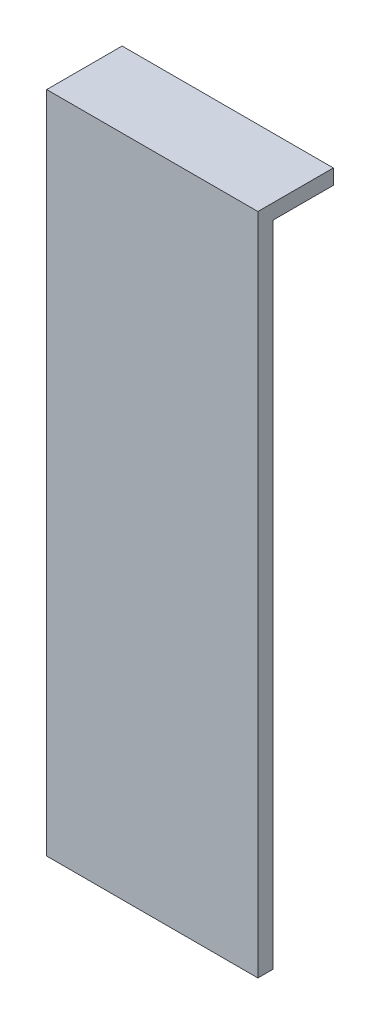
ISO-10303-21;
HEADER;
FILE_DESCRIPTION(('STEP AP214'),'2;1');
FILE_NAME('part.step','',(''),(''),'','','');
FILE_SCHEMA(('AUTOMOTIVE_DESIGN { 1 0 10303 214 1 1 1 1 }'));
ENDSEC;
DATA;
#1=APPLICATION_CONTEXT('core data for automotive mechanical design processes');
#2=APPLICATION_PROTOCOL_DEFINITION('international standard','automotive_design',2000,#1);
#3=PRODUCT_CONTEXT('',#1,'mechanical');
#4=PRODUCT('Part','Part','',(#3));
#5=PRODUCT_RELATED_PRODUCT_CATEGORY('part','',(#4));
#6=PRODUCT_DEFINITION_FORMATION('','',#4);
#7=PRODUCT_DEFINITION_CONTEXT('part definition',#1,'design');
#8=PRODUCT_DEFINITION('design','',#6,#7);
#9=PRODUCT_DEFINITION_SHAPE('','',#8);
#10=(LENGTH_UNIT() NAMED_UNIT(*) SI_UNIT(.MILLI.,.METRE.));
#11=(NAMED_UNIT(*) PLANE_ANGLE_UNIT() SI_UNIT($,.RADIAN.));
#12=(NAMED_UNIT(*) SI_UNIT($,.STERADIAN.) SOLID_ANGLE_UNIT());
#13=UNCERTAINTY_MEASURE_WITH_UNIT(LENGTH_MEASURE(1.E-05),#10,'distance_accuracy_value','');
#14=(GEOMETRIC_REPRESENTATION_CONTEXT(3) GLOBAL_UNCERTAINTY_ASSIGNED_CONTEXT((#13)) GLOBAL_UNIT_ASSIGNED_CONTEXT((#10,
#11,#12)) REPRESENTATION_CONTEXT('',''));
#15=CARTESIAN_POINT('',(0.,0.,0.));
#16=DIRECTION('',(0.,0.,1.));
#17=DIRECTION('',(1.,0.,0.));
#18=AXIS2_PLACEMENT_3D('',#15,#16,#17);
#19=CARTESIAN_POINT('',(-32.4311061643855,110.,5.));
#20=DIRECTION('',(-1.,0.,0.));
#21=DIRECTION('',(0.,-1.,0.));
#22=AXIS2_PLACEMENT_3D('',#19,#20,#21);
#23=PLANE('',#22);
#24=DIRECTION('',(0.,1.,0.));
#25=VECTOR('',#24,1.);
#26=CARTESIAN_POINT('',(-32.4311061643855,110.,0.));
#27=LINE('',#26,#25);
#28=CARTESIAN_POINT('',(-32.4311061643855,-110.,0.));
#29=VERTEX_POINT('',#28);
#30=CARTESIAN_POINT('',(-32.4311061643855,105.,0.));
#31=VERTEX_POINT('',#30);
#32=EDGE_CURVE('E120',#29,#31,#27,.T.);
#33=ORIENTED_EDGE('',*,*,#32,.T.);
#34=DIRECTION('',(0.,0.,1.));
#35=VECTOR('',#34,1.);
#36=CARTESIAN_POINT('',(-32.4311061643855,105.,-20.));
#37=LINE('',#36,#35);
#38=CARTESIAN_POINT('',(-32.4311061643855,105.,-20.));
#39=VERTEX_POINT('',#38);
#40=EDGE_CURVE('E154',#39,#31,#37,.T.);
#41=ORIENTED_EDGE('',*,*,#40,.F.);
#42=DIRECTION('',(0.,1.,0.));
#43=VECTOR('',#42,1.);
#44=CARTESIAN_POINT('',(-32.4311061643855,110.,-20.));
#45=LINE('',#44,#43);
#46=CARTESIAN_POINT('',(-32.4311061643855,110.,-20.));
#47=VERTEX_POINT('',#46);
#48=EDGE_CURVE('E195',#39,#47,#45,.T.);
#49=ORIENTED_EDGE('',*,*,#48,.T.);
#50=DIRECTION('',(0.,0.,-1.));
#51=VECTOR('',#50,1.);
#52=CARTESIAN_POINT('',(-32.4311061643855,110.,5.));
#53=LINE('',#52,#51);
#54=CARTESIAN_POINT('',(-32.4311061643855,110.,5.));
#55=VERTEX_POINT('',#54);
#56=EDGE_CURVE('E11',#55,#47,#53,.T.);
#57=ORIENTED_EDGE('',*,*,#56,.F.);
#58=DIRECTION('',(0.,1.,0.));
#59=VECTOR('',#58,1.);
#60=CARTESIAN_POINT('',(-32.4311061643855,110.,5.));
#61=LINE('',#60,#59);
#62=CARTESIAN_POINT('',(-32.4311061643855,-110.,5.));
#63=VERTEX_POINT('',#62);
#64=EDGE_CURVE('E100',#63,#55,#61,.T.);
#65=ORIENTED_EDGE('',*,*,#64,.F.);
#66=DIRECTION('',(0.,0.,-1.));
#67=VECTOR('',#66,1.);
#68=CARTESIAN_POINT('',(-32.4311061643855,-110.,5.));
#69=LINE('',#68,#67);
#70=EDGE_CURVE('E116',#63,#29,#69,.T.);
#71=ORIENTED_EDGE('',*,*,#70,.T.);
#72=EDGE_LOOP('',(#33,#41,#49,#57,#65,#71));
#73=FACE_BOUND('',#72,.T.);
#74=ADVANCED_FACE('F37',(#73),#23,.F.);
#75=CARTESIAN_POINT('',(-102.431106164386,110.,5.));
#76=DIRECTION('',(0.,-1.,0.));
#77=DIRECTION('',(0.,0.,-1.));
#78=AXIS2_PLACEMENT_3D('',#75,#76,#77);
#79=PLANE('',#78);
#80=ORIENTED_EDGE('',*,*,#56,.T.);
#81=DIRECTION('',(-1.,0.,0.));
#82=VECTOR('',#81,1.);
#83=CARTESIAN_POINT('',(-32.4311061643855,110.,-20.));
#84=LINE('',#83,#82);
#85=CARTESIAN_POINT('',(-102.431106164386,110.,-20.));
#86=VERTEX_POINT('',#85);
#87=EDGE_CURVE('E109',#47,#86,#84,.T.);
#88=ORIENTED_EDGE('',*,*,#87,.T.);
#89=DIRECTION('',(0.,0.,-1.));
#90=VECTOR('',#89,1.);
#91=CARTESIAN_POINT('',(-102.431106164386,110.,5.));
#92=LINE('',#91,#90);
#93=CARTESIAN_POINT('',(-102.431106164386,110.,5.));
#94=VERTEX_POINT('',#93);
#95=EDGE_CURVE('E44',#94,#86,#92,.T.);
#96=ORIENTED_EDGE('',*,*,#95,.F.);
#97=DIRECTION('',(-1.,0.,0.));
#98=VECTOR('',#97,1.);
#99=CARTESIAN_POINT('',(-102.431106164386,110.,5.));
#100=LINE('',#99,#98);
#101=EDGE_CURVE('E93',#55,#94,#100,.T.);
#102=ORIENTED_EDGE('',*,*,#101,.F.);
#103=EDGE_LOOP('',(#80,#88,#96,#102));
#104=FACE_BOUND('',#103,.T.);
#105=ADVANCED_FACE('F106',(#104),#79,.F.);
#106=CARTESIAN_POINT('',(-102.431106164386,110.,5.));
#107=DIRECTION('',(1.,0.,0.));
#108=DIRECTION('',(0.,1.,0.));
#109=AXIS2_PLACEMENT_3D('',#106,#107,#108);
#110=PLANE('',#109);
#111=ORIENTED_EDGE('',*,*,#95,.T.);
#112=DIRECTION('',(0.,-1.,0.));
#113=VECTOR('',#112,1.);
#114=CARTESIAN_POINT('',(-102.431106164386,110.,-20.));
#115=LINE('',#114,#113);
#116=CARTESIAN_POINT('',(-102.431106164386,105.,-20.));
#117=VERTEX_POINT('',#116);
#118=EDGE_CURVE('E191',#86,#117,#115,.T.);
#119=ORIENTED_EDGE('',*,*,#118,.T.);
#120=DIRECTION('',(0.,0.,1.));
#121=VECTOR('',#120,1.);
#122=CARTESIAN_POINT('',(-102.431106164386,105.,-20.));
#123=LINE('',#122,#121);
#124=CARTESIAN_POINT('',(-102.431106164386,105.,0.));
#125=VERTEX_POINT('',#124);
#126=EDGE_CURVE('E146',#117,#125,#123,.T.);
#127=ORIENTED_EDGE('',*,*,#126,.T.);
#128=DIRECTION('',(0.,-1.,0.));
#129=VECTOR('',#128,1.);
#130=CARTESIAN_POINT('',(-102.431106164386,110.,0.));
#131=LINE('',#130,#129);
#132=CARTESIAN_POINT('',(-102.431106164385,-9.99999999999995,0.));
#133=VERTEX_POINT('',#132);
#134=EDGE_CURVE('E51',#125,#133,#131,.T.);
#135=ORIENTED_EDGE('',*,*,#134,.T.);
#136=DIRECTION('',(0.,0.,1.));
#137=VECTOR('',#136,1.);
#138=CARTESIAN_POINT('',(-102.431106164385,-9.99999999999995,-10.));
#139=LINE('',#138,#137);
#140=CARTESIAN_POINT('',(-102.431106164385,-9.99999999999995,-10.));
#141=VERTEX_POINT('',#140);
#142=EDGE_CURVE('E79',#141,#133,#139,.T.);
#143=ORIENTED_EDGE('',*,*,#142,.F.);
#144=DIRECTION('',(0.,-1.,0.));
#145=VECTOR('',#144,1.);
#146=CARTESIAN_POINT('',(-102.431106164385,-110.,-10.));
#147=LINE('',#146,#145);
#148=CARTESIAN_POINT('',(-102.431106164385,-110.,-10.));
#149=VERTEX_POINT('',#148);
#150=EDGE_CURVE('E135',#141,#149,#147,.T.);
#151=ORIENTED_EDGE('',*,*,#150,.T.);
#152=DIRECTION('',(0.,0.,-1.));
#153=VECTOR('',#152,1.);
#154=CARTESIAN_POINT('',(-102.431106164385,-110.,5.));
#155=LINE('',#154,#153);
#156=CARTESIAN_POINT('',(-102.431106164385,-110.,5.));
#157=VERTEX_POINT('',#156);
#158=EDGE_CURVE('E112',#157,#149,#155,.T.);
#159=ORIENTED_EDGE('',*,*,#158,.F.);
#160=DIRECTION('',(0.,-1.,0.));
#161=VECTOR('',#160,1.);
#162=CARTESIAN_POINT('',(-102.431106164386,110.,5.));
#163=LINE('',#162,#161);
#164=EDGE_CURVE('E97',#94,#157,#163,.T.);
#165=ORIENTED_EDGE('',*,*,#164,.F.);
#166=EDGE_LOOP('',(#111,#119,#127,#135,#143,#151,#159,#165));
#167=FACE_BOUND('',#166,.T.);
#168=ADVANCED_FACE('F113',(#167),#110,.F.);
#169=CARTESIAN_POINT('',(-102.431106164385,-110.,5.));
#170=DIRECTION('',(0.,1.,0.));
#171=DIRECTION('',(0.,0.,1.));
#172=AXIS2_PLACEMENT_3D('',#169,#170,#171);
#173=PLANE('',#172);
#174=ORIENTED_EDGE('',*,*,#158,.T.);
#175=DIRECTION('',(1.,0.,0.));
#176=VECTOR('',#175,1.);
#177=CARTESIAN_POINT('',(-102.431106164385,-110.,-10.));
#178=LINE('',#177,#176);
#179=CARTESIAN_POINT('',(-97.4311061643855,-110.,-10.));
#180=VERTEX_POINT('',#179);
#181=EDGE_CURVE('E129',#149,#180,#178,.T.);
#182=ORIENTED_EDGE('',*,*,#181,.T.);
#183=DIRECTION('',(0.,0.,1.));
#184=VECTOR('',#183,1.);
#185=CARTESIAN_POINT('',(-97.4311061643855,-110.,-10.));
#186=LINE('',#185,#184);
#187=CARTESIAN_POINT('',(-97.4311061643855,-110.,0.));
#188=VERTEX_POINT('',#187);
#189=EDGE_CURVE('E152',#180,#188,#186,.T.);
#190=ORIENTED_EDGE('',*,*,#189,.T.);
#191=DIRECTION('',(1.,0.,0.));
#192=VECTOR('',#191,1.);
#193=CARTESIAN_POINT('',(-102.431106164385,-110.,0.));
#194=LINE('',#193,#192);
#195=EDGE_CURVE('E72',#188,#29,#194,.T.);
#196=ORIENTED_EDGE('',*,*,#195,.T.);
#197=ORIENTED_EDGE('',*,*,#70,.F.);
#198=DIRECTION('',(1.,0.,0.));
#199=VECTOR('',#198,1.);
#200=CARTESIAN_POINT('',(-102.431106164385,-110.,5.));
#201=LINE('',#200,#199);
#202=EDGE_CURVE('E60',#157,#63,#201,.T.);
#203=ORIENTED_EDGE('',*,*,#202,.F.);
#204=EDGE_LOOP('',(#174,#182,#190,#196,#197,#203));
#205=FACE_BOUND('',#204,.T.);
#206=ADVANCED_FACE('F128',(#205),#173,.F.);
#207=CARTESIAN_POINT('',(0.,0.,5.));
#208=DIRECTION('',(0.,0.,1.));
#209=DIRECTION('',(1.,0.,0.));
#210=AXIS2_PLACEMENT_3D('',#207,#208,#209);
#211=PLANE('',#210);
#212=ORIENTED_EDGE('',*,*,#64,.T.);
#213=ORIENTED_EDGE('',*,*,#101,.T.);
#214=ORIENTED_EDGE('',*,*,#164,.T.);
#215=ORIENTED_EDGE('',*,*,#202,.T.);
#216=EDGE_LOOP('',(#212,#213,#214,#215));
#217=FACE_BOUND('',#216,.T.);
#218=ADVANCED_FACE('F95',(#217),#211,.T.);
#219=CARTESIAN_POINT('',(0.,0.,0.));
#220=DIRECTION('',(0.,0.,1.));
#221=DIRECTION('',(1.,0.,0.));
#222=AXIS2_PLACEMENT_3D('',#219,#220,#221);
#223=PLANE('',#222);
#224=ORIENTED_EDGE('',*,*,#134,.F.);
#225=DIRECTION('',(1.,0.,0.));
#226=VECTOR('',#225,1.);
#227=CARTESIAN_POINT('',(-32.4311061643855,105.,0.));
#228=LINE('',#227,#226);
#229=EDGE_CURVE('E170',#125,#31,#228,.T.);
#230=ORIENTED_EDGE('',*,*,#229,.T.);
#231=ORIENTED_EDGE('',*,*,#32,.F.);
#232=ORIENTED_EDGE('',*,*,#195,.F.);
#233=DIRECTION('',(0.,1.,0.));
#234=VECTOR('',#233,1.);
#235=CARTESIAN_POINT('',(-97.4311061643855,-110.,0.));
#236=LINE('',#235,#234);
#237=CARTESIAN_POINT('',(-97.4311061643855,-9.99999999999995,0.));
#238=VERTEX_POINT('',#237);
#239=EDGE_CURVE('E143',#188,#238,#236,.T.);
#240=ORIENTED_EDGE('',*,*,#239,.T.);
#241=DIRECTION('',(-1.,0.,0.));
#242=VECTOR('',#241,1.);
#243=CARTESIAN_POINT('',(-102.431106164385,-9.99999999999995,0.));
#244=LINE('',#243,#242);
#245=EDGE_CURVE('E140',#238,#133,#244,.T.);
#246=ORIENTED_EDGE('',*,*,#245,.T.);
#247=EDGE_LOOP('',(#224,#230,#231,#232,#240,#246));
#248=FACE_BOUND('',#247,.T.);
#249=ADVANCED_FACE('F166',(#248),#223,.F.);
#250=CARTESIAN_POINT('',(-102.431106164385,-9.99999999999995,-10.));
#251=DIRECTION('',(0.,1.,0.));
#252=DIRECTION('',(0.,0.,1.));
#253=AXIS2_PLACEMENT_3D('',#250,#251,#252);
#254=PLANE('',#253);
#255=ORIENTED_EDGE('',*,*,#245,.F.);
#256=DIRECTION('',(0.,0.,1.));
#257=VECTOR('',#256,1.);
#258=CARTESIAN_POINT('',(-97.4311061643855,-9.99999999999995,-10.));
#259=LINE('',#258,#257);
#260=CARTESIAN_POINT('',(-97.4311061643855,-9.99999999999995,-10.));
#261=VERTEX_POINT('',#260);
#262=EDGE_CURVE('E157',#261,#238,#259,.T.);
#263=ORIENTED_EDGE('',*,*,#262,.F.);
#264=DIRECTION('',(-1.,0.,0.));
#265=VECTOR('',#264,1.);
#266=CARTESIAN_POINT('',(-102.431106164385,-9.99999999999995,-10.));
#267=LINE('',#266,#265);
#268=EDGE_CURVE('E150',#261,#141,#267,.T.);
#269=ORIENTED_EDGE('',*,*,#268,.T.);
#270=ORIENTED_EDGE('',*,*,#142,.T.);
#271=EDGE_LOOP('',(#255,#263,#269,#270));
#272=FACE_BOUND('',#271,.T.);
#273=ADVANCED_FACE('F219',(#272),#254,.T.);
#274=CARTESIAN_POINT('',(-97.4311061643855,-110.,-10.));
#275=DIRECTION('',(1.,0.,0.));
#276=DIRECTION('',(0.,0.,-1.));
#277=AXIS2_PLACEMENT_3D('',#274,#275,#276);
#278=PLANE('',#277);
#279=ORIENTED_EDGE('',*,*,#239,.F.);
#280=ORIENTED_EDGE('',*,*,#189,.F.);
#281=DIRECTION('',(0.,1.,0.));
#282=VECTOR('',#281,1.);
#283=CARTESIAN_POINT('',(-97.4311061643855,-110.,-10.));
#284=LINE('',#283,#282);
#285=EDGE_CURVE('E138',#180,#261,#284,.T.);
#286=ORIENTED_EDGE('',*,*,#285,.T.);
#287=ORIENTED_EDGE('',*,*,#262,.T.);
#288=EDGE_LOOP('',(#279,#280,#286,#287));
#289=FACE_BOUND('',#288,.T.);
#290=ADVANCED_FACE('F162',(#289),#278,.T.);
#291=CARTESIAN_POINT('',(0.,0.,-10.));
#292=DIRECTION('',(0.,0.,-1.));
#293=DIRECTION('',(-1.,0.,0.));
#294=AXIS2_PLACEMENT_3D('',#291,#292,#293);
#295=PLANE('',#294);
#296=ORIENTED_EDGE('',*,*,#150,.F.);
#297=ORIENTED_EDGE('',*,*,#268,.F.);
#298=ORIENTED_EDGE('',*,*,#285,.F.);
#299=ORIENTED_EDGE('',*,*,#181,.F.);
#300=EDGE_LOOP('',(#296,#297,#298,#299));
#301=FACE_BOUND('',#300,.T.);
#302=ADVANCED_FACE('F133',(#301),#295,.T.);
#303=CARTESIAN_POINT('',(-32.4311061643855,105.,-20.));
#304=DIRECTION('',(0.,-1.,0.));
#305=DIRECTION('',(1.,0.,0.));
#306=AXIS2_PLACEMENT_3D('',#303,#304,#305);
#307=PLANE('',#306);
#308=ORIENTED_EDGE('',*,*,#229,.F.);
#309=ORIENTED_EDGE('',*,*,#126,.F.);
#310=DIRECTION('',(1.,0.,0.));
#311=VECTOR('',#310,1.);
#312=CARTESIAN_POINT('',(-32.4311061643855,105.,-20.));
#313=LINE('',#312,#311);
#314=EDGE_CURVE('E190',#117,#39,#313,.T.);
#315=ORIENTED_EDGE('',*,*,#314,.T.);
#316=ORIENTED_EDGE('',*,*,#40,.T.);
#317=EDGE_LOOP('',(#308,#309,#315,#316));
#318=FACE_BOUND('',#317,.T.);
#319=ADVANCED_FACE('F188',(#318),#307,.T.);
#320=CARTESIAN_POINT('',(0.,0.,-20.));
#321=DIRECTION('',(0.,0.,-1.));
#322=DIRECTION('',(-1.,0.,0.));
#323=AXIS2_PLACEMENT_3D('',#320,#321,#322);
#324=PLANE('',#323);
#325=ORIENTED_EDGE('',*,*,#48,.F.);
#326=ORIENTED_EDGE('',*,*,#314,.F.);
#327=ORIENTED_EDGE('',*,*,#118,.F.);
#328=ORIENTED_EDGE('',*,*,#87,.F.);
#329=EDGE_LOOP('',(#325,#326,#327,#328));
#330=FACE_BOUND('',#329,.T.);
#331=ADVANCED_FACE('F194',(#330),#324,.T.);
#332=CLOSED_SHELL('',(#74,#105,#168,#206,#218,#249,#273,#290,#302,#319,#331));
#333=MANIFOLD_SOLID_BREP('B2',#332);
#334=ADVANCED_BREP_SHAPE_REPRESENTATION('',(#18,#333),#14);
#335=SHAPE_DEFINITION_REPRESENTATION(#9,#334);
ENDSEC;
END-ISO-10303-21;
